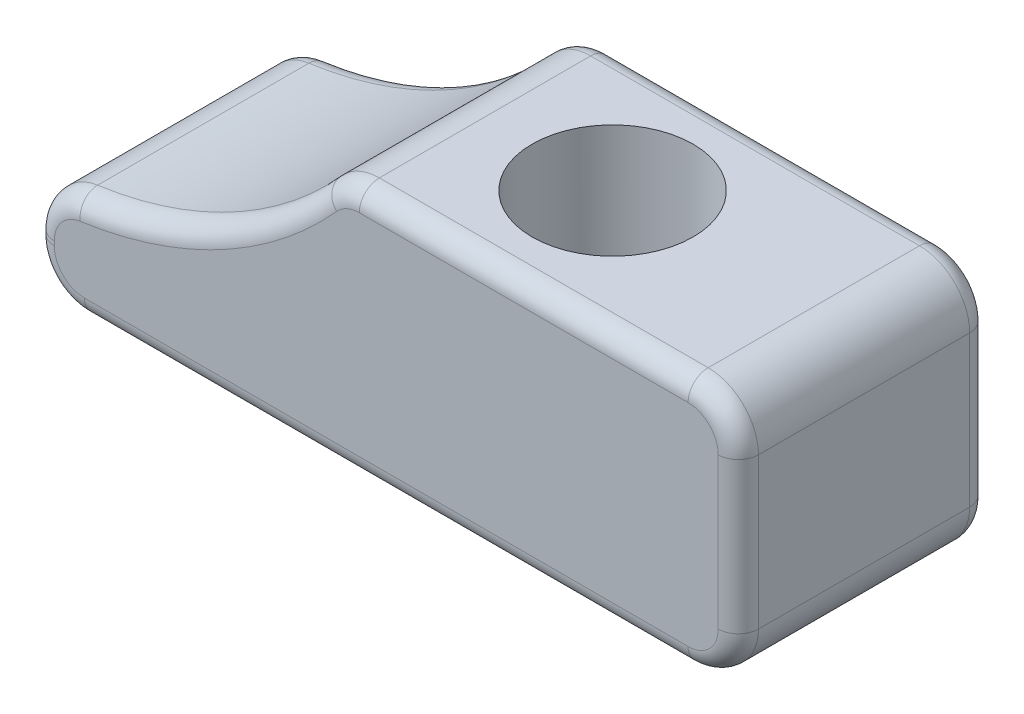
ISO-10303-21;
HEADER;
FILE_DESCRIPTION(('STEP AP214'),'2;1');
FILE_NAME('part.step','',(''),(''),'','','');
FILE_SCHEMA(('AUTOMOTIVE_DESIGN { 1 0 10303 214 1 1 1 1 }'));
ENDSEC;
DATA;
#1=APPLICATION_CONTEXT('core data for automotive mechanical design processes');
#2=APPLICATION_PROTOCOL_DEFINITION('international standard','automotive_design',2000,#1);
#3=PRODUCT_CONTEXT('',#1,'mechanical');
#4=PRODUCT('Part','Part','',(#3));
#5=PRODUCT_RELATED_PRODUCT_CATEGORY('part','',(#4));
#6=PRODUCT_DEFINITION_FORMATION('','',#4);
#7=PRODUCT_DEFINITION_CONTEXT('part definition',#1,'design');
#8=PRODUCT_DEFINITION('design','',#6,#7);
#9=PRODUCT_DEFINITION_SHAPE('','',#8);
#10=(LENGTH_UNIT() NAMED_UNIT(*) SI_UNIT(.MILLI.,.METRE.));
#11=(NAMED_UNIT(*) PLANE_ANGLE_UNIT() SI_UNIT($,.RADIAN.));
#12=(NAMED_UNIT(*) SI_UNIT($,.STERADIAN.) SOLID_ANGLE_UNIT());
#13=UNCERTAINTY_MEASURE_WITH_UNIT(LENGTH_MEASURE(1.E-05),#10,'distance_accuracy_value','');
#14=(GEOMETRIC_REPRESENTATION_CONTEXT(3) GLOBAL_UNCERTAINTY_ASSIGNED_CONTEXT((#13)) GLOBAL_UNIT_ASSIGNED_CONTEXT((#10,
#11,#12)) REPRESENTATION_CONTEXT('',''));
#15=CARTESIAN_POINT('',(0.,0.,0.));
#16=DIRECTION('',(0.,0.,1.));
#17=DIRECTION('',(1.,0.,0.));
#18=AXIS2_PLACEMENT_3D('',#15,#16,#17);
#19=CARTESIAN_POINT('',(0.,0.,25.));
#20=DIRECTION('',(1.,0.,0.));
#21=DIRECTION('',(0.,0.,-1.));
#22=AXIS2_PLACEMENT_3D('',#19,#20,#21);
#23=PLANE('',#22);
#24=DIRECTION('',(0.,0.,1.));
#25=VECTOR('',#24,1.);
#26=CARTESIAN_POINT('',(0.,5.41555698183141,25.));
#27=LINE('',#26,#25);
#28=CARTESIAN_POINT('',(0.,5.41555698183141,23.));
#29=VERTEX_POINT('',#28);
#30=CARTESIAN_POINT('',(0.,5.41555698183141,2.));
#31=VERTEX_POINT('',#30);
#32=EDGE_CURVE('E370',#29,#31,#27,.F.);
#33=ORIENTED_EDGE('',*,*,#32,.T.);
#34=DIRECTION('',(0.,-1.,0.));
#35=VECTOR('',#34,1.);
#36=CARTESIAN_POINT('',(0.,5.,2.));
#37=LINE('',#36,#35);
#38=CARTESIAN_POINT('',(0.,5.,2.));
#39=VERTEX_POINT('',#38);
#40=EDGE_CURVE('E234',#31,#39,#37,.T.);
#41=ORIENTED_EDGE('',*,*,#40,.T.);
#42=DIRECTION('',(0.,0.,-1.));
#43=VECTOR('',#42,1.);
#44=CARTESIAN_POINT('',(0.,5.,25.));
#45=LINE('',#44,#43);
#46=CARTESIAN_POINT('',(0.,5.,23.));
#47=VERTEX_POINT('',#46);
#48=EDGE_CURVE('E364',#39,#47,#45,.F.);
#49=ORIENTED_EDGE('',*,*,#48,.T.);
#50=DIRECTION('',(0.,-1.,0.));
#51=VECTOR('',#50,1.);
#52=CARTESIAN_POINT('',(0.,0.,23.));
#53=LINE('',#52,#51);
#54=EDGE_CURVE('E232',#47,#29,#53,.F.);
#55=ORIENTED_EDGE('',*,*,#54,.T.);
#56=EDGE_LOOP('',(#33,#41,#49,#55));
#57=FACE_BOUND('',#56,.T.);
#58=ADVANCED_FACE('F35',(#57),#23,.F.);
#59=CARTESIAN_POINT('',(0.,0.,25.));
#60=DIRECTION('',(0.,1.,0.));
#61=DIRECTION('',(0.,0.,1.));
#62=AXIS2_PLACEMENT_3D('',#59,#60,#61);
#63=PLANE('',#62);
#64=CARTESIAN_POINT('',(45.,0.,12.5));
#65=DIRECTION('',(0.,1.,0.));
#66=DIRECTION('',(0.,0.,1.));
#67=AXIS2_PLACEMENT_3D('',#64,#65,#66);
#68=CIRCLE('',#67,8.);
#69=CARTESIAN_POINT('',(45.,0.,20.5));
#70=VERTEX_POINT('',#69);
#71=EDGE_CURVE('E413',#70,#70,#68,.T.);
#72=ORIENTED_EDGE('',*,*,#71,.T.);
#73=EDGE_LOOP('',(#72));
#74=FACE_BOUND('',#73,.T.);
#75=DIRECTION('',(0.,0.,-1.));
#76=VECTOR('',#75,1.);
#77=CARTESIAN_POINT('',(5.,0.,25.));
#78=LINE('',#77,#76);
#79=CARTESIAN_POINT('',(5.,0.,23.));
#80=VERTEX_POINT('',#79);
#81=CARTESIAN_POINT('',(5.,0.,2.));
#82=VERTEX_POINT('',#81);
#83=EDGE_CURVE('E408',#80,#82,#78,.T.);
#84=ORIENTED_EDGE('',*,*,#83,.T.);
#85=DIRECTION('',(1.,0.,0.));
#86=VECTOR('',#85,1.);
#87=CARTESIAN_POINT('',(65.,0.,2.));
#88=LINE('',#87,#86);
#89=CARTESIAN_POINT('',(65.,0.,2.));
#90=VERTEX_POINT('',#89);
#91=EDGE_CURVE('E242',#82,#90,#88,.T.);
#92=ORIENTED_EDGE('',*,*,#91,.T.);
#93=DIRECTION('',(0.,0.,-1.));
#94=VECTOR('',#93,1.);
#95=CARTESIAN_POINT('',(65.,0.,25.));
#96=LINE('',#95,#94);
#97=CARTESIAN_POINT('',(65.,0.,23.));
#98=VERTEX_POINT('',#97);
#99=EDGE_CURVE('E283',#90,#98,#96,.F.);
#100=ORIENTED_EDGE('',*,*,#99,.T.);
#101=DIRECTION('',(1.,0.,0.));
#102=VECTOR('',#101,1.);
#103=CARTESIAN_POINT('',(0.,0.,23.));
#104=LINE('',#103,#102);
#105=EDGE_CURVE('E240',#98,#80,#104,.F.);
#106=ORIENTED_EDGE('',*,*,#105,.T.);
#107=EDGE_LOOP('',(#84,#92,#100,#106));
#108=FACE_BOUND('',#107,.T.);
#109=ADVANCED_FACE('F435',(#74,#108),#63,.F.);
#110=CARTESIAN_POINT('',(70.,0.,25.));
#111=DIRECTION('',(-1.,0.,0.));
#112=DIRECTION('',(0.,0.,1.));
#113=AXIS2_PLACEMENT_3D('',#110,#111,#112);
#114=PLANE('',#113);
#115=DIRECTION('',(0.,0.,-1.));
#116=VECTOR('',#115,1.);
#117=CARTESIAN_POINT('',(70.,5.,25.));
#118=LINE('',#117,#116);
#119=CARTESIAN_POINT('',(70.,5.,23.));
#120=VERTEX_POINT('',#119);
#121=CARTESIAN_POINT('',(70.,5.,2.));
#122=VERTEX_POINT('',#121);
#123=EDGE_CURVE('E193',#120,#122,#118,.T.);
#124=ORIENTED_EDGE('',*,*,#123,.T.);
#125=DIRECTION('',(0.,1.,0.));
#126=VECTOR('',#125,1.);
#127=CARTESIAN_POINT('',(70.,20.,2.));
#128=LINE('',#127,#126);
#129=CARTESIAN_POINT('',(70.,20.,2.));
#130=VERTEX_POINT('',#129);
#131=EDGE_CURVE('E209',#122,#130,#128,.T.);
#132=ORIENTED_EDGE('',*,*,#131,.T.);
#133=DIRECTION('',(0.,0.,-1.));
#134=VECTOR('',#133,1.);
#135=CARTESIAN_POINT('',(70.,20.,25.));
#136=LINE('',#135,#134);
#137=CARTESIAN_POINT('',(70.,20.,23.));
#138=VERTEX_POINT('',#137);
#139=EDGE_CURVE('E326',#130,#138,#136,.F.);
#140=ORIENTED_EDGE('',*,*,#139,.T.);
#141=DIRECTION('',(0.,1.,0.));
#142=VECTOR('',#141,1.);
#143=CARTESIAN_POINT('',(70.,0.,23.));
#144=LINE('',#143,#142);
#145=EDGE_CURVE('E207',#138,#120,#144,.F.);
#146=ORIENTED_EDGE('',*,*,#145,.T.);
#147=EDGE_LOOP('',(#124,#132,#140,#146));
#148=FACE_BOUND('',#147,.T.);
#149=ADVANCED_FACE('F324',(#148),#114,.F.);
#150=CARTESIAN_POINT('',(0.,25.,25.));
#151=DIRECTION('',(0.,-1.,0.));
#152=DIRECTION('',(0.,0.,-1.));
#153=AXIS2_PLACEMENT_3D('',#150,#151,#152);
#154=PLANE('',#153);
#155=CARTESIAN_POINT('',(45.,25.,12.5));
#156=DIRECTION('',(0.,-1.,0.));
#157=DIRECTION('',(0.,0.,-1.));
#158=AXIS2_PLACEMENT_3D('',#155,#156,#157);
#159=CIRCLE('',#158,8.);
#160=CARTESIAN_POINT('',(45.,25.,4.50000000000001));
#161=VERTEX_POINT('',#160);
#162=EDGE_CURVE('E39',#161,#161,#159,.T.);
#163=ORIENTED_EDGE('',*,*,#162,.T.);
#164=EDGE_LOOP('',(#163));
#165=FACE_BOUND('',#164,.T.);
#166=DIRECTION('',(0.,0.,-1.));
#167=VECTOR('',#166,1.);
#168=CARTESIAN_POINT('',(65.,25.,25.));
#169=LINE('',#168,#167);
#170=CARTESIAN_POINT('',(65.,25.,23.));
#171=VERTEX_POINT('',#170);
#172=CARTESIAN_POINT('',(65.,25.,2.));
#173=VERTEX_POINT('',#172);
#174=EDGE_CURVE('E360',#171,#173,#169,.T.);
#175=ORIENTED_EDGE('',*,*,#174,.T.);
#176=DIRECTION('',(-1.,0.,0.));
#177=VECTOR('',#176,1.);
#178=CARTESIAN_POINT('',(32.3178335842491,25.,2.));
#179=LINE('',#178,#177);
#180=CARTESIAN_POINT('',(32.3178335842491,25.,2.));
#181=VERTEX_POINT('',#180);
#182=EDGE_CURVE('E217',#173,#181,#179,.T.);
#183=ORIENTED_EDGE('',*,*,#182,.T.);
#184=DIRECTION('',(0.,0.,1.));
#185=VECTOR('',#184,1.);
#186=CARTESIAN_POINT('',(32.3178335842491,25.,25.));
#187=LINE('',#186,#185);
#188=CARTESIAN_POINT('',(32.3178335842491,25.,23.));
#189=VERTEX_POINT('',#188);
#190=EDGE_CURVE('E363',#181,#189,#187,.T.);
#191=ORIENTED_EDGE('',*,*,#190,.T.);
#192=DIRECTION('',(-1.,0.,0.));
#193=VECTOR('',#192,1.);
#194=CARTESIAN_POINT('',(0.,25.,23.));
#195=LINE('',#194,#193);
#196=EDGE_CURVE('E215',#189,#171,#195,.F.);
#197=ORIENTED_EDGE('',*,*,#196,.T.);
#198=EDGE_LOOP('',(#175,#183,#191,#197));
#199=FACE_BOUND('',#198,.T.);
#200=ADVANCED_FACE('F420',(#165,#199),#154,.F.);
#201=CARTESIAN_POINT('',(0.,0.,25.));
#202=DIRECTION('',(0.,0.,-1.));
#203=DIRECTION('',(-1.,0.,0.));
#204=AXIS2_PLACEMENT_3D('',#201,#202,#203);
#205=PLANE('',#204);
#206=CARTESIAN_POINT('',(-1.24038176891171,49.9807635378234,25.));
#207=DIRECTION('',(0.,0.,-1.));
#208=DIRECTION('',(-1.,0.,0.));
#209=AXIS2_PLACEMENT_3D('',#206,#207,#208);
#210=CIRCLE('',#209,42.);
#211=CARTESIAN_POINT('',(30.0806192273717,21.9987175691882,25.));
#212=VERTEX_POINT('',#211);
#213=CARTESIAN_POINT('',(4.58397454873922,8.38657075223087,25.));
#214=VERTEX_POINT('',#213);
#215=EDGE_CURVE('E44',#212,#214,#210,.T.);
#216=ORIENTED_EDGE('',*,*,#215,.T.);
#217=CARTESIAN_POINT('',(5.,5.41555698183141,25.));
#218=DIRECTION('',(0.,0.,-1.));
#219=DIRECTION('',(-1.,0.,0.));
#220=AXIS2_PLACEMENT_3D('',#217,#218,#219);
#221=CIRCLE('',#220,3.);
#222=CARTESIAN_POINT('',(2.,5.41555698183141,25.));
#223=VERTEX_POINT('',#222);
#224=EDGE_CURVE('E11',#214,#223,#221,.F.);
#225=ORIENTED_EDGE('',*,*,#224,.T.);
#226=DIRECTION('',(0.,-1.,0.));
#227=VECTOR('',#226,1.);
#228=CARTESIAN_POINT('',(2.,0.,25.));
#229=LINE('',#228,#227);
#230=CARTESIAN_POINT('',(2.,5.,25.));
#231=VERTEX_POINT('',#230);
#232=EDGE_CURVE('E244',#223,#231,#229,.T.);
#233=ORIENTED_EDGE('',*,*,#232,.T.);
#234=CARTESIAN_POINT('',(5.,5.,25.));
#235=DIRECTION('',(0.,0.,-1.));
#236=DIRECTION('',(-1.,0.,0.));
#237=AXIS2_PLACEMENT_3D('',#234,#235,#236);
#238=CIRCLE('',#237,3.);
#239=CARTESIAN_POINT('',(5.,2.,25.));
#240=VERTEX_POINT('',#239);
#241=EDGE_CURVE('E246',#231,#240,#238,.F.);
#242=ORIENTED_EDGE('',*,*,#241,.T.);
#243=DIRECTION('',(1.,0.,0.));
#244=VECTOR('',#243,1.);
#245=CARTESIAN_POINT('',(0.,2.,25.));
#246=LINE('',#245,#244);
#247=CARTESIAN_POINT('',(65.,2.,25.));
#248=VERTEX_POINT('',#247);
#249=EDGE_CURVE('E248',#240,#248,#246,.T.);
#250=ORIENTED_EDGE('',*,*,#249,.T.);
#251=CARTESIAN_POINT('',(65.,5.,25.));
#252=DIRECTION('',(0.,0.,-1.));
#253=DIRECTION('',(-1.,0.,0.));
#254=AXIS2_PLACEMENT_3D('',#251,#252,#253);
#255=CIRCLE('',#254,3.);
#256=CARTESIAN_POINT('',(68.,5.,25.));
#257=VERTEX_POINT('',#256);
#258=EDGE_CURVE('E250',#248,#257,#255,.F.);
#259=ORIENTED_EDGE('',*,*,#258,.T.);
#260=DIRECTION('',(0.,1.,0.));
#261=VECTOR('',#260,1.);
#262=CARTESIAN_POINT('',(68.,0.,25.));
#263=LINE('',#262,#261);
#264=CARTESIAN_POINT('',(68.,20.,25.));
#265=VERTEX_POINT('',#264);
#266=EDGE_CURVE('E252',#257,#265,#263,.T.);
#267=ORIENTED_EDGE('',*,*,#266,.T.);
#268=CARTESIAN_POINT('',(65.,20.,25.));
#269=DIRECTION('',(0.,0.,-1.));
#270=DIRECTION('',(-1.,0.,0.));
#271=AXIS2_PLACEMENT_3D('',#268,#269,#270);
#272=CIRCLE('',#271,3.);
#273=CARTESIAN_POINT('',(65.,23.,25.));
#274=VERTEX_POINT('',#273);
#275=EDGE_CURVE('E254',#265,#274,#272,.F.);
#276=ORIENTED_EDGE('',*,*,#275,.T.);
#277=DIRECTION('',(-1.,0.,0.));
#278=VECTOR('',#277,1.);
#279=CARTESIAN_POINT('',(0.,23.,25.));
#280=LINE('',#279,#278);
#281=CARTESIAN_POINT('',(32.3178335842491,23.,25.));
#282=VERTEX_POINT('',#281);
#283=EDGE_CURVE('E256',#274,#282,#280,.T.);
#284=ORIENTED_EDGE('',*,*,#283,.T.);
#285=CARTESIAN_POINT('',(32.3178335842491,20.,25.));
#286=DIRECTION('',(0.,0.,-1.));
#287=DIRECTION('',(-1.,0.,0.));
#288=AXIS2_PLACEMENT_3D('',#285,#286,#287);
#289=CIRCLE('',#288,3.);
#290=EDGE_CURVE('E55',#282,#212,#289,.F.);
#291=ORIENTED_EDGE('',*,*,#290,.T.);
#292=EDGE_LOOP('',(#216,#225,#233,#242,#250,#259,#267,#276,#284,#291));
#293=FACE_BOUND('',#292,.T.);
#294=ADVANCED_FACE('F585',(#293),#205,.F.);
#295=CARTESIAN_POINT('',(0.,0.,0.));
#296=DIRECTION('',(0.,0.,-1.));
#297=DIRECTION('',(-1.,0.,0.));
#298=AXIS2_PLACEMENT_3D('',#295,#296,#297);
#299=PLANE('',#298);
#300=DIRECTION('',(0.,1.,0.));
#301=VECTOR('',#300,1.);
#302=CARTESIAN_POINT('',(68.,5.,0.));
#303=LINE('',#302,#301);
#304=CARTESIAN_POINT('',(68.,20.,0.));
#305=VERTEX_POINT('',#304);
#306=CARTESIAN_POINT('',(68.,5.,0.));
#307=VERTEX_POINT('',#306);
#308=EDGE_CURVE('E197',#305,#307,#303,.F.);
#309=ORIENTED_EDGE('',*,*,#308,.T.);
#310=CARTESIAN_POINT('',(65.,5.,0.));
#311=DIRECTION('',(0.,0.,-1.));
#312=DIRECTION('',(-1.,0.,0.));
#313=AXIS2_PLACEMENT_3D('',#310,#311,#312);
#314=CIRCLE('',#313,3.);
#315=CARTESIAN_POINT('',(65.,2.,0.));
#316=VERTEX_POINT('',#315);
#317=EDGE_CURVE('E177',#307,#316,#314,.T.);
#318=ORIENTED_EDGE('',*,*,#317,.T.);
#319=DIRECTION('',(1.,0.,0.));
#320=VECTOR('',#319,1.);
#321=CARTESIAN_POINT('',(5.,2.,0.));
#322=LINE('',#321,#320);
#323=CARTESIAN_POINT('',(5.,2.,0.));
#324=VERTEX_POINT('',#323);
#325=EDGE_CURVE('E186',#316,#324,#322,.F.);
#326=ORIENTED_EDGE('',*,*,#325,.T.);
#327=CARTESIAN_POINT('',(5.,5.,0.));
#328=DIRECTION('',(0.,0.,-1.));
#329=DIRECTION('',(-1.,0.,0.));
#330=AXIS2_PLACEMENT_3D('',#327,#328,#329);
#331=CIRCLE('',#330,3.);
#332=CARTESIAN_POINT('',(2.,5.,0.));
#333=VERTEX_POINT('',#332);
#334=EDGE_CURVE('E192',#324,#333,#331,.T.);
#335=ORIENTED_EDGE('',*,*,#334,.T.);
#336=DIRECTION('',(0.,-1.,0.));
#337=VECTOR('',#336,1.);
#338=CARTESIAN_POINT('',(2.,5.41555698183141,0.));
#339=LINE('',#338,#337);
#340=CARTESIAN_POINT('',(2.,5.41555698183141,0.));
#341=VERTEX_POINT('',#340);
#342=EDGE_CURVE('E337',#333,#341,#339,.F.);
#343=ORIENTED_EDGE('',*,*,#342,.T.);
#344=CARTESIAN_POINT('',(5.,5.41555698183141,0.));
#345=DIRECTION('',(0.,0.,-1.));
#346=DIRECTION('',(-1.,0.,0.));
#347=AXIS2_PLACEMENT_3D('',#344,#345,#346);
#348=CIRCLE('',#347,3.);
#349=CARTESIAN_POINT('',(4.58397454873922,8.38657075223088,0.));
#350=VERTEX_POINT('',#349);
#351=EDGE_CURVE('E339',#341,#350,#348,.T.);
#352=ORIENTED_EDGE('',*,*,#351,.T.);
#353=CARTESIAN_POINT('',(-1.24038176891171,49.9807635378234,0.));
#354=DIRECTION('',(0.,0.,-1.));
#355=DIRECTION('',(-1.,0.,0.));
#356=AXIS2_PLACEMENT_3D('',#353,#354,#355);
#357=CIRCLE('',#356,42.);
#358=CARTESIAN_POINT('',(30.0806192273717,21.9987175691882,0.));
#359=VERTEX_POINT('',#358);
#360=EDGE_CURVE('E341',#350,#359,#357,.F.);
#361=ORIENTED_EDGE('',*,*,#360,.T.);
#362=CARTESIAN_POINT('',(32.3178335842491,20.,0.));
#363=DIRECTION('',(0.,0.,-1.));
#364=DIRECTION('',(-1.,0.,0.));
#365=AXIS2_PLACEMENT_3D('',#362,#363,#364);
#366=CIRCLE('',#365,3.);
#367=CARTESIAN_POINT('',(32.3178335842491,23.,0.));
#368=VERTEX_POINT('',#367);
#369=EDGE_CURVE('E343',#359,#368,#366,.T.);
#370=ORIENTED_EDGE('',*,*,#369,.T.);
#371=DIRECTION('',(-1.,0.,0.));
#372=VECTOR('',#371,1.);
#373=CARTESIAN_POINT('',(65.,23.,0.));
#374=LINE('',#373,#372);
#375=CARTESIAN_POINT('',(65.,23.,0.));
#376=VERTEX_POINT('',#375);
#377=EDGE_CURVE('E345',#368,#376,#374,.F.);
#378=ORIENTED_EDGE('',*,*,#377,.T.);
#379=CARTESIAN_POINT('',(65.,20.,0.));
#380=DIRECTION('',(0.,0.,-1.));
#381=DIRECTION('',(-1.,0.,0.));
#382=AXIS2_PLACEMENT_3D('',#379,#380,#381);
#383=CIRCLE('',#382,3.);
#384=EDGE_CURVE('E202',#376,#305,#383,.T.);
#385=ORIENTED_EDGE('',*,*,#384,.T.);
#386=EDGE_LOOP('',(#309,#318,#326,#335,#343,#352,#361,#370,#378,#385));
#387=FACE_BOUND('',#386,.T.);
#388=ADVANCED_FACE('F195',(#387),#299,.T.);
#389=CARTESIAN_POINT('',(-1.24038176891171,49.9807635378234,0.));
#390=DIRECTION('',(0.,0.,1.));
#391=DIRECTION('',(1.,0.,0.));
#392=AXIS2_PLACEMENT_3D('',#389,#390,#391);
#393=CYLINDRICAL_SURFACE('',#392,40.);
#394=DIRECTION('',(0.,0.,1.));
#395=VECTOR('',#394,1.);
#396=CARTESIAN_POINT('',(28.5891429894534,23.331195948647,0.));
#397=LINE('',#396,#395);
#398=CARTESIAN_POINT('',(28.5891429894534,23.331195948647,23.));
#399=VERTEX_POINT('',#398);
#400=CARTESIAN_POINT('',(28.5891429894534,23.331195948647,2.));
#401=VERTEX_POINT('',#400);
#402=EDGE_CURVE('E332',#399,#401,#397,.F.);
#403=ORIENTED_EDGE('',*,*,#402,.T.);
#404=CARTESIAN_POINT('',(-1.24038176891171,49.9807635378234,2.));
#405=DIRECTION('',(0.,0.,-1.));
#406=DIRECTION('',(-1.,0.,0.));
#407=AXIS2_PLACEMENT_3D('',#404,#405,#406);
#408=CIRCLE('',#407,40.);
#409=CARTESIAN_POINT('',(4.3066242478987,10.3672465991639,2.));
#410=VERTEX_POINT('',#409);
#411=EDGE_CURVE('E225',#401,#410,#408,.T.);
#412=ORIENTED_EDGE('',*,*,#411,.T.);
#413=DIRECTION('',(0.,0.,1.));
#414=VECTOR('',#413,1.);
#415=CARTESIAN_POINT('',(4.3066242478987,10.3672465991639,0.));
#416=LINE('',#415,#414);
#417=CARTESIAN_POINT('',(4.3066242478987,10.3672465991639,23.));
#418=VERTEX_POINT('',#417);
#419=EDGE_CURVE('E367',#410,#418,#416,.T.);
#420=ORIENTED_EDGE('',*,*,#419,.T.);
#421=CARTESIAN_POINT('',(-1.24038176891171,49.9807635378234,23.));
#422=DIRECTION('',(0.,0.,-1.));
#423=DIRECTION('',(-1.,0.,0.));
#424=AXIS2_PLACEMENT_3D('',#421,#422,#423);
#425=CIRCLE('',#424,40.);
#426=EDGE_CURVE('E223',#418,#399,#425,.F.);
#427=ORIENTED_EDGE('',*,*,#426,.T.);
#428=EDGE_LOOP('',(#403,#412,#420,#427));
#429=FACE_BOUND('',#428,.T.);
#430=ADVANCED_FACE('F379',(#429),#393,.F.);
#431=CARTESIAN_POINT('',(5.,5.,25.));
#432=DIRECTION('',(0.,0.,-1.));
#433=DIRECTION('',(-1.,0.,0.));
#434=AXIS2_PLACEMENT_3D('',#431,#432,#433);
#435=CYLINDRICAL_SURFACE('',#434,5.);
#436=ORIENTED_EDGE('',*,*,#48,.F.);
#437=CARTESIAN_POINT('',(5.,5.,2.));
#438=DIRECTION('',(0.,0.,-1.));
#439=DIRECTION('',(-1.,0.,0.));
#440=AXIS2_PLACEMENT_3D('',#437,#438,#439);
#441=CIRCLE('',#440,5.);
#442=EDGE_CURVE('E238',#39,#82,#441,.F.);
#443=ORIENTED_EDGE('',*,*,#442,.T.);
#444=ORIENTED_EDGE('',*,*,#83,.F.);
#445=CARTESIAN_POINT('',(5.,5.,23.));
#446=DIRECTION('',(0.,0.,-1.));
#447=DIRECTION('',(-1.,0.,0.));
#448=AXIS2_PLACEMENT_3D('',#445,#446,#447);
#449=CIRCLE('',#448,5.);
#450=EDGE_CURVE('E236',#80,#47,#449,.T.);
#451=ORIENTED_EDGE('',*,*,#450,.T.);
#452=EDGE_LOOP('',(#436,#443,#444,#451));
#453=FACE_BOUND('',#452,.T.);
#454=ADVANCED_FACE('F443',(#453),#435,.T.);
#455=CARTESIAN_POINT('',(32.3178335842491,20.,0.));
#456=DIRECTION('',(0.,0.,1.));
#457=DIRECTION('',(1.,0.,0.));
#458=AXIS2_PLACEMENT_3D('',#455,#456,#457);
#459=CYLINDRICAL_SURFACE('',#458,5.);
#460=ORIENTED_EDGE('',*,*,#190,.F.);
#461=CARTESIAN_POINT('',(32.3178335842491,20.,2.));
#462=DIRECTION('',(0.,0.,-1.));
#463=DIRECTION('',(-1.,0.,0.));
#464=AXIS2_PLACEMENT_3D('',#461,#462,#463);
#465=CIRCLE('',#464,5.);
#466=EDGE_CURVE('E221',#181,#401,#465,.F.);
#467=ORIENTED_EDGE('',*,*,#466,.T.);
#468=ORIENTED_EDGE('',*,*,#402,.F.);
#469=CARTESIAN_POINT('',(32.3178335842491,20.,23.));
#470=DIRECTION('',(0.,0.,-1.));
#471=DIRECTION('',(-1.,0.,0.));
#472=AXIS2_PLACEMENT_3D('',#469,#470,#471);
#473=CIRCLE('',#472,5.);
#474=EDGE_CURVE('E219',#399,#189,#473,.T.);
#475=ORIENTED_EDGE('',*,*,#474,.T.);
#476=EDGE_LOOP('',(#460,#467,#468,#475));
#477=FACE_BOUND('',#476,.T.);
#478=ADVANCED_FACE('F446',(#477),#459,.T.);
#479=CARTESIAN_POINT('',(5.,5.41555698183141,0.));
#480=DIRECTION('',(0.,0.,1.));
#481=DIRECTION('',(1.,0.,0.));
#482=AXIS2_PLACEMENT_3D('',#479,#480,#481);
#483=CYLINDRICAL_SURFACE('',#482,5.);
#484=ORIENTED_EDGE('',*,*,#419,.F.);
#485=CARTESIAN_POINT('',(5.,5.41555698183141,2.));
#486=DIRECTION('',(0.,0.,-1.));
#487=DIRECTION('',(-1.,0.,0.));
#488=AXIS2_PLACEMENT_3D('',#485,#486,#487);
#489=CIRCLE('',#488,5.);
#490=EDGE_CURVE('E230',#410,#31,#489,.F.);
#491=ORIENTED_EDGE('',*,*,#490,.T.);
#492=ORIENTED_EDGE('',*,*,#32,.F.);
#493=CARTESIAN_POINT('',(5.,5.41555698183141,23.));
#494=DIRECTION('',(0.,0.,-1.));
#495=DIRECTION('',(-1.,0.,0.));
#496=AXIS2_PLACEMENT_3D('',#493,#494,#495);
#497=CIRCLE('',#496,5.);
#498=EDGE_CURVE('E227',#29,#418,#497,.T.);
#499=ORIENTED_EDGE('',*,*,#498,.T.);
#500=EDGE_LOOP('',(#484,#491,#492,#499));
#501=FACE_BOUND('',#500,.T.);
#502=ADVANCED_FACE('F403',(#501),#483,.T.);
#503=CARTESIAN_POINT('',(65.,5.,25.));
#504=DIRECTION('',(0.,0.,-1.));
#505=DIRECTION('',(-1.,0.,0.));
#506=AXIS2_PLACEMENT_3D('',#503,#504,#505);
#507=CYLINDRICAL_SURFACE('',#506,5.);
#508=ORIENTED_EDGE('',*,*,#99,.F.);
#509=CARTESIAN_POINT('',(65.,5.,2.));
#510=DIRECTION('',(0.,0.,-1.));
#511=DIRECTION('',(-1.,0.,0.));
#512=AXIS2_PLACEMENT_3D('',#509,#510,#511);
#513=CIRCLE('',#512,5.);
#514=EDGE_CURVE('E179',#90,#122,#513,.F.);
#515=ORIENTED_EDGE('',*,*,#514,.T.);
#516=ORIENTED_EDGE('',*,*,#123,.F.);
#517=CARTESIAN_POINT('',(65.,5.,23.));
#518=DIRECTION('',(0.,0.,-1.));
#519=DIRECTION('',(-1.,0.,0.));
#520=AXIS2_PLACEMENT_3D('',#517,#518,#519);
#521=CIRCLE('',#520,5.);
#522=EDGE_CURVE('E199',#120,#98,#521,.T.);
#523=ORIENTED_EDGE('',*,*,#522,.T.);
#524=EDGE_LOOP('',(#508,#515,#516,#523));
#525=FACE_BOUND('',#524,.T.);
#526=ADVANCED_FACE('F329',(#525),#507,.T.);
#527=CARTESIAN_POINT('',(65.,20.,25.));
#528=DIRECTION('',(0.,0.,-1.));
#529=DIRECTION('',(-1.,0.,0.));
#530=AXIS2_PLACEMENT_3D('',#527,#528,#529);
#531=CYLINDRICAL_SURFACE('',#530,5.);
#532=ORIENTED_EDGE('',*,*,#139,.F.);
#533=CARTESIAN_POINT('',(65.,20.,2.));
#534=DIRECTION('',(0.,0.,-1.));
#535=DIRECTION('',(-1.,0.,0.));
#536=AXIS2_PLACEMENT_3D('',#533,#534,#535);
#537=CIRCLE('',#536,5.);
#538=EDGE_CURVE('E213',#130,#173,#537,.F.);
#539=ORIENTED_EDGE('',*,*,#538,.T.);
#540=ORIENTED_EDGE('',*,*,#174,.F.);
#541=CARTESIAN_POINT('',(65.,20.,23.));
#542=DIRECTION('',(0.,0.,-1.));
#543=DIRECTION('',(-1.,0.,0.));
#544=AXIS2_PLACEMENT_3D('',#541,#542,#543);
#545=CIRCLE('',#544,5.);
#546=EDGE_CURVE('E211',#171,#138,#545,.T.);
#547=ORIENTED_EDGE('',*,*,#546,.T.);
#548=EDGE_LOOP('',(#532,#539,#540,#547));
#549=FACE_BOUND('',#548,.T.);
#550=ADVANCED_FACE('F357',(#549),#531,.T.);
#551=CARTESIAN_POINT('',(-1.24038176891171,49.9807635378234,2.));
#552=DIRECTION('',(0.,0.,-1.));
#553=DIRECTION('',(-1.,0.,0.));
#554=AXIS2_PLACEMENT_3D('',#551,#552,#553);
#555=TOROIDAL_SURFACE('',#554,42.,2.);
#556=CARTESIAN_POINT('',(4.58397454873922,8.38657075223087,2.));
#557=DIRECTION('',(-0.990337923466489,-0.13867515042026,0.));
#558=DIRECTION('',(0.13867515042026,-0.990337923466489,0.));
#559=AXIS2_PLACEMENT_3D('',#556,#557,#558);
#560=CIRCLE('',#559,2.);
#561=EDGE_CURVE('E277',#410,#350,#560,.T.);
#562=ORIENTED_EDGE('',*,*,#561,.F.);
#563=ORIENTED_EDGE('',*,*,#411,.F.);
#564=CARTESIAN_POINT('',(30.0806192273717,21.9987175691882,2.));
#565=DIRECTION('',(0.666239189729408,0.74573811895913,0.));
#566=DIRECTION('',(-0.74573811895913,0.666239189729408,0.));
#567=AXIS2_PLACEMENT_3D('',#564,#565,#566);
#568=CIRCLE('',#567,2.);
#569=EDGE_CURVE('E280',#359,#401,#568,.T.);
#570=ORIENTED_EDGE('',*,*,#569,.F.);
#571=ORIENTED_EDGE('',*,*,#360,.F.);
#572=EDGE_LOOP('',(#562,#563,#570,#571));
#573=FACE_BOUND('',#572,.T.);
#574=ADVANCED_FACE('F387',(#573),#555,.T.);
#575=CARTESIAN_POINT('',(32.3178335842491,20.,2.));
#576=DIRECTION('',(0.,0.,-1.));
#577=DIRECTION('',(-1.,0.,0.));
#578=AXIS2_PLACEMENT_3D('',#575,#576,#577);
#579=TOROIDAL_SURFACE('',#578,3.,2.);
#580=ORIENTED_EDGE('',*,*,#569,.T.);
#581=ORIENTED_EDGE('',*,*,#466,.F.);
#582=CARTESIAN_POINT('',(32.3178335842491,23.,2.));
#583=DIRECTION('',(1.,0.,0.));
#584=DIRECTION('',(0.,0.,-1.));
#585=AXIS2_PLACEMENT_3D('',#582,#583,#584);
#586=CIRCLE('',#585,2.);
#587=EDGE_CURVE('E274',#368,#181,#586,.T.);
#588=ORIENTED_EDGE('',*,*,#587,.F.);
#589=ORIENTED_EDGE('',*,*,#369,.F.);
#590=EDGE_LOOP('',(#580,#581,#588,#589));
#591=FACE_BOUND('',#590,.T.);
#592=ADVANCED_FACE('F393',(#591),#579,.T.);
#593=CARTESIAN_POINT('',(5.,5.41555698183141,2.));
#594=DIRECTION('',(0.,0.,-1.));
#595=DIRECTION('',(-1.,0.,0.));
#596=AXIS2_PLACEMENT_3D('',#593,#594,#595);
#597=TOROIDAL_SURFACE('',#596,3.,2.);
#598=ORIENTED_EDGE('',*,*,#561,.T.);
#599=ORIENTED_EDGE('',*,*,#351,.F.);
#600=CARTESIAN_POINT('',(2.,5.41555698183141,2.));
#601=DIRECTION('',(0.,-1.,0.));
#602=DIRECTION('',(0.,0.,-1.));
#603=AXIS2_PLACEMENT_3D('',#600,#601,#602);
#604=CIRCLE('',#603,2.);
#605=EDGE_CURVE('E271',#31,#341,#604,.T.);
#606=ORIENTED_EDGE('',*,*,#605,.F.);
#607=ORIENTED_EDGE('',*,*,#490,.F.);
#608=EDGE_LOOP('',(#598,#599,#606,#607));
#609=FACE_BOUND('',#608,.T.);
#610=ADVANCED_FACE('F397',(#609),#597,.T.);
#611=CARTESIAN_POINT('',(0.,23.,2.));
#612=DIRECTION('',(1.,0.,0.));
#613=DIRECTION('',(0.,0.,-1.));
#614=AXIS2_PLACEMENT_3D('',#611,#612,#613);
#615=CYLINDRICAL_SURFACE('',#614,2.);
#616=ORIENTED_EDGE('',*,*,#587,.T.);
#617=ORIENTED_EDGE('',*,*,#182,.F.);
#618=CARTESIAN_POINT('',(65.,23.,2.));
#619=DIRECTION('',(1.,0.,0.));
#620=DIRECTION('',(0.,0.,-1.));
#621=AXIS2_PLACEMENT_3D('',#618,#619,#620);
#622=CIRCLE('',#621,2.);
#623=EDGE_CURVE('E268',#376,#173,#622,.T.);
#624=ORIENTED_EDGE('',*,*,#623,.F.);
#625=ORIENTED_EDGE('',*,*,#377,.F.);
#626=EDGE_LOOP('',(#616,#617,#624,#625));
#627=FACE_BOUND('',#626,.T.);
#628=ADVANCED_FACE('F471',(#627),#615,.T.);
#629=CARTESIAN_POINT('',(2.,0.,2.));
#630=DIRECTION('',(0.,1.,0.));
#631=DIRECTION('',(0.,0.,1.));
#632=AXIS2_PLACEMENT_3D('',#629,#630,#631);
#633=CYLINDRICAL_SURFACE('',#632,2.);
#634=ORIENTED_EDGE('',*,*,#605,.T.);
#635=ORIENTED_EDGE('',*,*,#342,.F.);
#636=CARTESIAN_POINT('',(2.,5.,2.));
#637=DIRECTION('',(0.,-1.,0.));
#638=DIRECTION('',(0.,0.,-1.));
#639=AXIS2_PLACEMENT_3D('',#636,#637,#638);
#640=CIRCLE('',#639,2.);
#641=EDGE_CURVE('E265',#39,#333,#640,.T.);
#642=ORIENTED_EDGE('',*,*,#641,.F.);
#643=ORIENTED_EDGE('',*,*,#40,.F.);
#644=EDGE_LOOP('',(#634,#635,#642,#643));
#645=FACE_BOUND('',#644,.T.);
#646=ADVANCED_FACE('F468',(#645),#633,.T.);
#647=CARTESIAN_POINT('',(65.,20.,2.));
#648=DIRECTION('',(0.,0.,-1.));
#649=DIRECTION('',(-1.,0.,0.));
#650=AXIS2_PLACEMENT_3D('',#647,#648,#649);
#651=TOROIDAL_SURFACE('',#650,3.,2.);
#652=ORIENTED_EDGE('',*,*,#623,.T.);
#653=ORIENTED_EDGE('',*,*,#538,.F.);
#654=CARTESIAN_POINT('',(68.,20.,2.));
#655=DIRECTION('',(0.,-1.,0.));
#656=DIRECTION('',(0.,0.,-1.));
#657=AXIS2_PLACEMENT_3D('',#654,#655,#656);
#658=CIRCLE('',#657,2.);
#659=EDGE_CURVE('E262',#305,#130,#658,.T.);
#660=ORIENTED_EDGE('',*,*,#659,.F.);
#661=ORIENTED_EDGE('',*,*,#384,.F.);
#662=EDGE_LOOP('',(#652,#653,#660,#661));
#663=FACE_BOUND('',#662,.T.);
#664=ADVANCED_FACE('F352',(#663),#651,.T.);
#665=CARTESIAN_POINT('',(5.,5.,2.));
#666=DIRECTION('',(0.,0.,-1.));
#667=DIRECTION('',(-1.,0.,0.));
#668=AXIS2_PLACEMENT_3D('',#665,#666,#667);
#669=TOROIDAL_SURFACE('',#668,3.,2.);
#670=ORIENTED_EDGE('',*,*,#641,.T.);
#671=ORIENTED_EDGE('',*,*,#334,.F.);
#672=CARTESIAN_POINT('',(5.,2.,2.));
#673=DIRECTION('',(1.,0.,0.));
#674=DIRECTION('',(0.,0.,-1.));
#675=AXIS2_PLACEMENT_3D('',#672,#673,#674);
#676=CIRCLE('',#675,2.);
#677=EDGE_CURVE('E189',#82,#324,#676,.T.);
#678=ORIENTED_EDGE('',*,*,#677,.F.);
#679=ORIENTED_EDGE('',*,*,#442,.F.);
#680=EDGE_LOOP('',(#670,#671,#678,#679));
#681=FACE_BOUND('',#680,.T.);
#682=ADVANCED_FACE('F462',(#681),#669,.T.);
#683=CARTESIAN_POINT('',(68.,0.,2.));
#684=DIRECTION('',(0.,-1.,0.));
#685=DIRECTION('',(0.,0.,-1.));
#686=AXIS2_PLACEMENT_3D('',#683,#684,#685);
#687=CYLINDRICAL_SURFACE('',#686,2.);
#688=ORIENTED_EDGE('',*,*,#659,.T.);
#689=ORIENTED_EDGE('',*,*,#131,.F.);
#690=CARTESIAN_POINT('',(68.,5.,2.));
#691=DIRECTION('',(0.,-1.,0.));
#692=DIRECTION('',(0.,0.,-1.));
#693=AXIS2_PLACEMENT_3D('',#690,#691,#692);
#694=CIRCLE('',#693,2.);
#695=EDGE_CURVE('E182',#307,#122,#694,.T.);
#696=ORIENTED_EDGE('',*,*,#695,.F.);
#697=ORIENTED_EDGE('',*,*,#308,.F.);
#698=EDGE_LOOP('',(#688,#689,#696,#697));
#699=FACE_BOUND('',#698,.T.);
#700=ADVANCED_FACE('F355',(#699),#687,.T.);
#701=CARTESIAN_POINT('',(0.,2.,2.));
#702=DIRECTION('',(-1.,0.,0.));
#703=DIRECTION('',(0.,0.,1.));
#704=AXIS2_PLACEMENT_3D('',#701,#702,#703);
#705=CYLINDRICAL_SURFACE('',#704,2.);
#706=ORIENTED_EDGE('',*,*,#677,.T.);
#707=ORIENTED_EDGE('',*,*,#325,.F.);
#708=CARTESIAN_POINT('',(65.,2.,2.));
#709=DIRECTION('',(1.,0.,0.));
#710=DIRECTION('',(0.,0.,-1.));
#711=AXIS2_PLACEMENT_3D('',#708,#709,#710);
#712=CIRCLE('',#711,2.);
#713=EDGE_CURVE('E173',#90,#316,#712,.T.);
#714=ORIENTED_EDGE('',*,*,#713,.F.);
#715=ORIENTED_EDGE('',*,*,#91,.F.);
#716=EDGE_LOOP('',(#706,#707,#714,#715));
#717=FACE_BOUND('',#716,.T.);
#718=ADVANCED_FACE('F187',(#717),#705,.T.);
#719=CARTESIAN_POINT('',(65.,5.,2.));
#720=DIRECTION('',(0.,0.,-1.));
#721=DIRECTION('',(-1.,0.,0.));
#722=AXIS2_PLACEMENT_3D('',#719,#720,#721);
#723=TOROIDAL_SURFACE('',#722,3.,2.);
#724=ORIENTED_EDGE('',*,*,#695,.T.);
#725=ORIENTED_EDGE('',*,*,#514,.F.);
#726=ORIENTED_EDGE('',*,*,#713,.T.);
#727=ORIENTED_EDGE('',*,*,#317,.F.);
#728=EDGE_LOOP('',(#724,#725,#726,#727));
#729=FACE_BOUND('',#728,.T.);
#730=ADVANCED_FACE('F175',(#729),#723,.T.);
#731=CARTESIAN_POINT('',(68.,0.,23.));
#732=DIRECTION('',(0.,1.,0.));
#733=DIRECTION('',(0.,0.,1.));
#734=AXIS2_PLACEMENT_3D('',#731,#732,#733);
#735=CYLINDRICAL_SURFACE('',#734,2.);
#736=CARTESIAN_POINT('',(68.,5.,23.));
#737=DIRECTION('',(0.,-1.,0.));
#738=DIRECTION('',(0.,0.,-1.));
#739=AXIS2_PLACEMENT_3D('',#736,#737,#738);
#740=CIRCLE('',#739,2.);
#741=EDGE_CURVE('E306',#120,#257,#740,.T.);
#742=ORIENTED_EDGE('',*,*,#741,.F.);
#743=ORIENTED_EDGE('',*,*,#145,.F.);
#744=CARTESIAN_POINT('',(68.,20.,23.));
#745=DIRECTION('',(0.,1.,0.));
#746=DIRECTION('',(0.,0.,1.));
#747=AXIS2_PLACEMENT_3D('',#744,#745,#746);
#748=CIRCLE('',#747,2.);
#749=EDGE_CURVE('E183',#265,#138,#748,.T.);
#750=ORIENTED_EDGE('',*,*,#749,.F.);
#751=ORIENTED_EDGE('',*,*,#266,.F.);
#752=EDGE_LOOP('',(#742,#743,#750,#751));
#753=FACE_BOUND('',#752,.T.);
#754=ADVANCED_FACE('F37',(#753),#735,.T.);
#755=CARTESIAN_POINT('',(65.,20.,23.));
#756=DIRECTION('',(0.,0.,-1.));
#757=DIRECTION('',(-1.,0.,0.));
#758=AXIS2_PLACEMENT_3D('',#755,#756,#757);
#759=TOROIDAL_SURFACE('',#758,3.,2.);
#760=ORIENTED_EDGE('',*,*,#749,.T.);
#761=ORIENTED_EDGE('',*,*,#546,.F.);
#762=CARTESIAN_POINT('',(65.,23.,23.));
#763=DIRECTION('',(-1.,0.,0.));
#764=DIRECTION('',(0.,0.,1.));
#765=AXIS2_PLACEMENT_3D('',#762,#763,#764);
#766=CIRCLE('',#765,2.);
#767=EDGE_CURVE('E303',#274,#171,#766,.T.);
#768=ORIENTED_EDGE('',*,*,#767,.F.);
#769=ORIENTED_EDGE('',*,*,#275,.F.);
#770=EDGE_LOOP('',(#760,#761,#768,#769));
#771=FACE_BOUND('',#770,.T.);
#772=ADVANCED_FACE('F313',(#771),#759,.T.);
#773=CARTESIAN_POINT('',(65.,5.,23.));
#774=DIRECTION('',(0.,0.,-1.));
#775=DIRECTION('',(-1.,0.,0.));
#776=AXIS2_PLACEMENT_3D('',#773,#774,#775);
#777=TOROIDAL_SURFACE('',#776,3.,2.);
#778=ORIENTED_EDGE('',*,*,#741,.T.);
#779=ORIENTED_EDGE('',*,*,#258,.F.);
#780=CARTESIAN_POINT('',(65.,2.,23.));
#781=DIRECTION('',(-1.,0.,0.));
#782=DIRECTION('',(0.,0.,1.));
#783=AXIS2_PLACEMENT_3D('',#780,#781,#782);
#784=CIRCLE('',#783,2.);
#785=EDGE_CURVE('E300',#98,#248,#784,.T.);
#786=ORIENTED_EDGE('',*,*,#785,.F.);
#787=ORIENTED_EDGE('',*,*,#522,.F.);
#788=EDGE_LOOP('',(#778,#779,#786,#787));
#789=FACE_BOUND('',#788,.T.);
#790=ADVANCED_FACE('F504',(#789),#777,.T.);
#791=CARTESIAN_POINT('',(0.,23.,23.));
#792=DIRECTION('',(-1.,0.,0.));
#793=DIRECTION('',(0.,0.,1.));
#794=AXIS2_PLACEMENT_3D('',#791,#792,#793);
#795=CYLINDRICAL_SURFACE('',#794,2.);
#796=ORIENTED_EDGE('',*,*,#767,.T.);
#797=ORIENTED_EDGE('',*,*,#196,.F.);
#798=CARTESIAN_POINT('',(32.3178335842491,23.,23.));
#799=DIRECTION('',(-1.,0.,0.));
#800=DIRECTION('',(0.,0.,1.));
#801=AXIS2_PLACEMENT_3D('',#798,#799,#800);
#802=CIRCLE('',#801,2.);
#803=EDGE_CURVE('E297',#282,#189,#802,.T.);
#804=ORIENTED_EDGE('',*,*,#803,.F.);
#805=ORIENTED_EDGE('',*,*,#283,.F.);
#806=EDGE_LOOP('',(#796,#797,#804,#805));
#807=FACE_BOUND('',#806,.T.);
#808=ADVANCED_FACE('F500',(#807),#795,.T.);
#809=CARTESIAN_POINT('',(0.,2.,23.));
#810=DIRECTION('',(1.,0.,0.));
#811=DIRECTION('',(0.,0.,-1.));
#812=AXIS2_PLACEMENT_3D('',#809,#810,#811);
#813=CYLINDRICAL_SURFACE('',#812,2.);
#814=ORIENTED_EDGE('',*,*,#785,.T.);
#815=ORIENTED_EDGE('',*,*,#249,.F.);
#816=CARTESIAN_POINT('',(5.,2.,23.));
#817=DIRECTION('',(-1.,0.,0.));
#818=DIRECTION('',(0.,0.,1.));
#819=AXIS2_PLACEMENT_3D('',#816,#817,#818);
#820=CIRCLE('',#819,2.);
#821=EDGE_CURVE('E294',#80,#240,#820,.T.);
#822=ORIENTED_EDGE('',*,*,#821,.F.);
#823=ORIENTED_EDGE('',*,*,#105,.F.);
#824=EDGE_LOOP('',(#814,#815,#822,#823));
#825=FACE_BOUND('',#824,.T.);
#826=ADVANCED_FACE('F496',(#825),#813,.T.);
#827=CARTESIAN_POINT('',(32.3178335842491,20.,23.));
#828=DIRECTION('',(0.,0.,-1.));
#829=DIRECTION('',(-1.,0.,0.));
#830=AXIS2_PLACEMENT_3D('',#827,#828,#829);
#831=TOROIDAL_SURFACE('',#830,3.,2.);
#832=ORIENTED_EDGE('',*,*,#803,.T.);
#833=ORIENTED_EDGE('',*,*,#474,.F.);
#834=CARTESIAN_POINT('',(30.0806192273717,21.9987175691882,23.));
#835=DIRECTION('',(-0.66623918972941,-0.745738118959128,0.));
#836=DIRECTION('',(0.745738118959128,-0.66623918972941,0.));
#837=AXIS2_PLACEMENT_3D('',#834,#835,#836);
#838=CIRCLE('',#837,2.);
#839=EDGE_CURVE('E291',#212,#399,#838,.T.);
#840=ORIENTED_EDGE('',*,*,#839,.F.);
#841=ORIENTED_EDGE('',*,*,#290,.F.);
#842=EDGE_LOOP('',(#832,#833,#840,#841));
#843=FACE_BOUND('',#842,.T.);
#844=ADVANCED_FACE('F492',(#843),#831,.T.);
#845=CARTESIAN_POINT('',(5.,5.,23.));
#846=DIRECTION('',(0.,0.,-1.));
#847=DIRECTION('',(-1.,0.,0.));
#848=AXIS2_PLACEMENT_3D('',#845,#846,#847);
#849=TOROIDAL_SURFACE('',#848,3.,2.);
#850=ORIENTED_EDGE('',*,*,#821,.T.);
#851=ORIENTED_EDGE('',*,*,#241,.F.);
#852=CARTESIAN_POINT('',(2.,5.,23.));
#853=DIRECTION('',(0.,1.,0.));
#854=DIRECTION('',(0.,0.,1.));
#855=AXIS2_PLACEMENT_3D('',#852,#853,#854);
#856=CIRCLE('',#855,2.);
#857=EDGE_CURVE('E288',#47,#231,#856,.T.);
#858=ORIENTED_EDGE('',*,*,#857,.F.);
#859=ORIENTED_EDGE('',*,*,#450,.F.);
#860=EDGE_LOOP('',(#850,#851,#858,#859));
#861=FACE_BOUND('',#860,.T.);
#862=ADVANCED_FACE('F488',(#861),#849,.T.);
#863=CARTESIAN_POINT('',(-1.24038176891171,49.9807635378234,23.));
#864=DIRECTION('',(0.,0.,-1.));
#865=DIRECTION('',(-1.,0.,0.));
#866=AXIS2_PLACEMENT_3D('',#863,#864,#865);
#867=TOROIDAL_SURFACE('',#866,42.,2.);
#868=ORIENTED_EDGE('',*,*,#839,.T.);
#869=ORIENTED_EDGE('',*,*,#426,.F.);
#870=CARTESIAN_POINT('',(4.58397454873922,8.38657075223087,23.));
#871=DIRECTION('',(-0.990337923466489,-0.13867515042026,0.));
#872=DIRECTION('',(0.13867515042026,-0.99033792346649,0.));
#873=AXIS2_PLACEMENT_3D('',#870,#871,#872);
#874=CIRCLE('',#873,2.);
#875=EDGE_CURVE('E286',#214,#418,#874,.T.);
#876=ORIENTED_EDGE('',*,*,#875,.F.);
#877=ORIENTED_EDGE('',*,*,#215,.F.);
#878=EDGE_LOOP('',(#868,#869,#876,#877));
#879=FACE_BOUND('',#878,.T.);
#880=ADVANCED_FACE('F484',(#879),#867,.T.);
#881=CARTESIAN_POINT('',(2.,0.,23.));
#882=DIRECTION('',(0.,-1.,0.));
#883=DIRECTION('',(0.,0.,-1.));
#884=AXIS2_PLACEMENT_3D('',#881,#882,#883);
#885=CYLINDRICAL_SURFACE('',#884,2.);
#886=ORIENTED_EDGE('',*,*,#857,.T.);
#887=ORIENTED_EDGE('',*,*,#232,.F.);
#888=CARTESIAN_POINT('',(2.,5.41555698183141,23.));
#889=DIRECTION('',(0.,1.,0.));
#890=DIRECTION('',(0.,0.,1.));
#891=AXIS2_PLACEMENT_3D('',#888,#889,#890);
#892=CIRCLE('',#891,2.);
#893=EDGE_CURVE('E284',#29,#223,#892,.T.);
#894=ORIENTED_EDGE('',*,*,#893,.F.);
#895=ORIENTED_EDGE('',*,*,#54,.F.);
#896=EDGE_LOOP('',(#886,#887,#894,#895));
#897=FACE_BOUND('',#896,.T.);
#898=ADVANCED_FACE('F430',(#897),#885,.T.);
#899=CARTESIAN_POINT('',(5.,5.41555698183141,23.));
#900=DIRECTION('',(0.,0.,-1.));
#901=DIRECTION('',(-1.,0.,0.));
#902=AXIS2_PLACEMENT_3D('',#899,#900,#901);
#903=TOROIDAL_SURFACE('',#902,3.,2.);
#904=ORIENTED_EDGE('',*,*,#875,.T.);
#905=ORIENTED_EDGE('',*,*,#498,.F.);
#906=ORIENTED_EDGE('',*,*,#893,.T.);
#907=ORIENTED_EDGE('',*,*,#224,.F.);
#908=EDGE_LOOP('',(#904,#905,#906,#907));
#909=FACE_BOUND('',#908,.T.);
#910=ADVANCED_FACE('F424',(#909),#903,.T.);
#911=CARTESIAN_POINT('',(45.,0.,12.5));
#912=DIRECTION('',(0.,1.,0.));
#913=DIRECTION('',(0.,0.,1.));
#914=AXIS2_PLACEMENT_3D('',#911,#912,#913);
#915=CYLINDRICAL_SURFACE('',#914,8.);
#916=ORIENTED_EDGE('',*,*,#71,.F.);
#917=EDGE_LOOP('',(#916));
#918=FACE_BOUND('',#917,.T.);
#919=ORIENTED_EDGE('',*,*,#162,.F.);
#920=EDGE_LOOP('',(#919));
#921=FACE_BOUND('',#920,.T.);
#922=ADVANCED_FACE('F422',(#918,#921),#915,.F.);
#923=CLOSED_SHELL('',(#58,#109,#149,#200,#294,#388,#430,#454,#478,#502,#526,#550,#574,#592,#610,
#628,#646,#664,#682,#700,#718,#730,#754,#772,#790,#808,#826,#844,#862,#880,#898,#910,#922));
#924=MANIFOLD_SOLID_BREP('B2',#923);
#925=ADVANCED_BREP_SHAPE_REPRESENTATION('',(#18,#924),#14);
#926=SHAPE_DEFINITION_REPRESENTATION(#9,#925);
ENDSEC;
END-ISO-10303-21;
